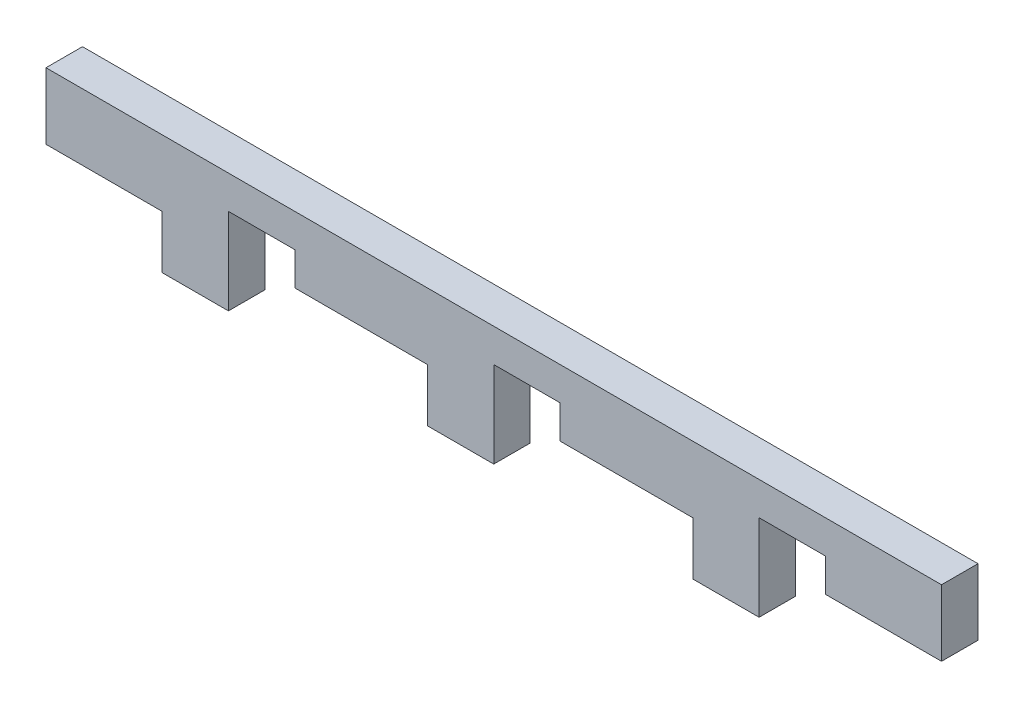
ISO-10303-21;
HEADER;
FILE_DESCRIPTION(('STEP AP214'),'2;1');
FILE_NAME('part.step','',(''),(''),'','','');
FILE_SCHEMA(('AUTOMOTIVE_DESIGN { 1 0 10303 214 1 1 1 1 }'));
ENDSEC;
DATA;
#1=APPLICATION_CONTEXT('core data for automotive mechanical design processes');
#2=APPLICATION_PROTOCOL_DEFINITION('international standard','automotive_design',2000,#1);
#3=PRODUCT_CONTEXT('',#1,'mechanical');
#4=PRODUCT('Part','Part','',(#3));
#5=PRODUCT_RELATED_PRODUCT_CATEGORY('part','',(#4));
#6=PRODUCT_DEFINITION_FORMATION('','',#4);
#7=PRODUCT_DEFINITION_CONTEXT('part definition',#1,'design');
#8=PRODUCT_DEFINITION('design','',#6,#7);
#9=PRODUCT_DEFINITION_SHAPE('','',#8);
#10=(LENGTH_UNIT() NAMED_UNIT(*) SI_UNIT(.MILLI.,.METRE.));
#11=(NAMED_UNIT(*) PLANE_ANGLE_UNIT() SI_UNIT($,.RADIAN.));
#12=(NAMED_UNIT(*) SI_UNIT($,.STERADIAN.) SOLID_ANGLE_UNIT());
#13=UNCERTAINTY_MEASURE_WITH_UNIT(LENGTH_MEASURE(1.E-05),#10,'distance_accuracy_value','');
#14=(GEOMETRIC_REPRESENTATION_CONTEXT(3) GLOBAL_UNCERTAINTY_ASSIGNED_CONTEXT((#13)) GLOBAL_UNIT_ASSIGNED_CONTEXT((#10,
#11,#12)) REPRESENTATION_CONTEXT('',''));
#15=CARTESIAN_POINT('',(0.,0.,0.));
#16=DIRECTION('',(0.,0.,1.));
#17=DIRECTION('',(1.,0.,0.));
#18=AXIS2_PLACEMENT_3D('',#15,#16,#17);
#19=CARTESIAN_POINT('',(67.5,-10.,5.5));
#20=DIRECTION('',(-1.,0.,0.));
#21=DIRECTION('',(0.,0.,1.));
#22=AXIS2_PLACEMENT_3D('',#19,#20,#21);
#23=PLANE('',#22);
#24=DIRECTION('',(0.,1.,0.));
#25=VECTOR('',#24,1.);
#26=CARTESIAN_POINT('',(67.5,-10.,0.));
#27=LINE('',#26,#25);
#28=CARTESIAN_POINT('',(67.5,-10.,0.));
#29=VERTEX_POINT('',#28);
#30=CARTESIAN_POINT('',(67.5,0.,0.));
#31=VERTEX_POINT('',#30);
#32=EDGE_CURVE('E230',#29,#31,#27,.T.);
#33=ORIENTED_EDGE('',*,*,#32,.T.);
#34=DIRECTION('',(0.,0.,-1.));
#35=VECTOR('',#34,1.);
#36=CARTESIAN_POINT('',(67.5,0.,5.5));
#37=LINE('',#36,#35);
#38=CARTESIAN_POINT('',(67.5,0.,5.5));
#39=VERTEX_POINT('',#38);
#40=EDGE_CURVE('E11',#39,#31,#37,.T.);
#41=ORIENTED_EDGE('',*,*,#40,.F.);
#42=DIRECTION('',(0.,1.,0.));
#43=VECTOR('',#42,1.);
#44=CARTESIAN_POINT('',(67.5,-10.,5.5));
#45=LINE('',#44,#43);
#46=CARTESIAN_POINT('',(67.5,-10.,5.5));
#47=VERTEX_POINT('',#46);
#48=EDGE_CURVE('E294',#47,#39,#45,.T.);
#49=ORIENTED_EDGE('',*,*,#48,.F.);
#50=DIRECTION('',(0.,0.,-1.));
#51=VECTOR('',#50,1.);
#52=CARTESIAN_POINT('',(67.5,-10.,5.5));
#53=LINE('',#52,#51);
#54=EDGE_CURVE('E226',#47,#29,#53,.T.);
#55=ORIENTED_EDGE('',*,*,#54,.T.);
#56=EDGE_LOOP('',(#33,#41,#49,#55));
#57=FACE_BOUND('',#56,.T.);
#58=ADVANCED_FACE('F45',(#57),#23,.F.);
#59=CARTESIAN_POINT('',(-67.5,0.,5.5));
#60=DIRECTION('',(0.,-1.,0.));
#61=DIRECTION('',(0.,0.,-1.));
#62=AXIS2_PLACEMENT_3D('',#59,#60,#61);
#63=PLANE('',#62);
#64=DIRECTION('',(-1.,0.,0.));
#65=VECTOR('',#64,1.);
#66=CARTESIAN_POINT('',(-67.5,0.,0.));
#67=LINE('',#66,#65);
#68=CARTESIAN_POINT('',(-67.5,0.,0.));
#69=VERTEX_POINT('',#68);
#70=EDGE_CURVE('E234',#31,#69,#67,.T.);
#71=ORIENTED_EDGE('',*,*,#70,.T.);
#72=DIRECTION('',(0.,0.,-1.));
#73=VECTOR('',#72,1.);
#74=CARTESIAN_POINT('',(-67.5,0.,5.5));
#75=LINE('',#74,#73);
#76=CARTESIAN_POINT('',(-67.5,0.,5.5));
#77=VERTEX_POINT('',#76);
#78=EDGE_CURVE('E54',#77,#69,#75,.T.);
#79=ORIENTED_EDGE('',*,*,#78,.F.);
#80=DIRECTION('',(-1.,0.,0.));
#81=VECTOR('',#80,1.);
#82=CARTESIAN_POINT('',(-67.5,0.,5.5));
#83=LINE('',#82,#81);
#84=EDGE_CURVE('E147',#39,#77,#83,.T.);
#85=ORIENTED_EDGE('',*,*,#84,.F.);
#86=ORIENTED_EDGE('',*,*,#40,.T.);
#87=EDGE_LOOP('',(#71,#79,#85,#86));
#88=FACE_BOUND('',#87,.T.);
#89=ADVANCED_FACE('F458',(#88),#63,.F.);
#90=CARTESIAN_POINT('',(-67.5,-10.,5.5));
#91=DIRECTION('',(1.,0.,0.));
#92=DIRECTION('',(0.,0.,-1.));
#93=AXIS2_PLACEMENT_3D('',#90,#91,#92);
#94=PLANE('',#93);
#95=DIRECTION('',(0.,-1.,0.));
#96=VECTOR('',#95,1.);
#97=CARTESIAN_POINT('',(-67.5,-10.,0.));
#98=LINE('',#97,#96);
#99=CARTESIAN_POINT('',(-67.5,-10.,0.));
#100=VERTEX_POINT('',#99);
#101=EDGE_CURVE('E237',#69,#100,#98,.T.);
#102=ORIENTED_EDGE('',*,*,#101,.T.);
#103=DIRECTION('',(0.,0.,-1.));
#104=VECTOR('',#103,1.);
#105=CARTESIAN_POINT('',(-67.5,-10.,5.5));
#106=LINE('',#105,#104);
#107=CARTESIAN_POINT('',(-67.5,-10.,5.5));
#108=VERTEX_POINT('',#107);
#109=EDGE_CURVE('E361',#108,#100,#106,.T.);
#110=ORIENTED_EDGE('',*,*,#109,.F.);
#111=DIRECTION('',(0.,-1.,0.));
#112=VECTOR('',#111,1.);
#113=CARTESIAN_POINT('',(-67.5,-10.,5.5));
#114=LINE('',#113,#112);
#115=EDGE_CURVE('E371',#77,#108,#114,.T.);
#116=ORIENTED_EDGE('',*,*,#115,.F.);
#117=ORIENTED_EDGE('',*,*,#78,.T.);
#118=EDGE_LOOP('',(#102,#110,#116,#117));
#119=FACE_BOUND('',#118,.T.);
#120=ADVANCED_FACE('F369',(#119),#94,.F.);
#121=CARTESIAN_POINT('',(-50.,-10.,5.5));
#122=DIRECTION('',(0.,1.,0.));
#123=DIRECTION('',(-1.,0.,0.));
#124=AXIS2_PLACEMENT_3D('',#121,#122,#123);
#125=PLANE('',#124);
#126=DIRECTION('',(1.,0.,0.));
#127=VECTOR('',#126,1.);
#128=CARTESIAN_POINT('',(-50.,-10.,0.));
#129=LINE('',#128,#127);
#130=CARTESIAN_POINT('',(-50.,-10.,0.));
#131=VERTEX_POINT('',#130);
#132=EDGE_CURVE('E240',#100,#131,#129,.T.);
#133=ORIENTED_EDGE('',*,*,#132,.T.);
#134=DIRECTION('',(0.,0.,-1.));
#135=VECTOR('',#134,1.);
#136=CARTESIAN_POINT('',(-50.,-10.,5.5));
#137=LINE('',#136,#135);
#138=CARTESIAN_POINT('',(-50.,-10.,5.5));
#139=VERTEX_POINT('',#138);
#140=EDGE_CURVE('E357',#139,#131,#137,.T.);
#141=ORIENTED_EDGE('',*,*,#140,.F.);
#142=DIRECTION('',(1.,0.,0.));
#143=VECTOR('',#142,1.);
#144=CARTESIAN_POINT('',(-50.,-10.,5.5));
#145=LINE('',#144,#143);
#146=EDGE_CURVE('E390',#108,#139,#145,.T.);
#147=ORIENTED_EDGE('',*,*,#146,.F.);
#148=ORIENTED_EDGE('',*,*,#109,.T.);
#149=EDGE_LOOP('',(#133,#141,#147,#148));
#150=FACE_BOUND('',#149,.T.);
#151=ADVANCED_FACE('F380',(#150),#125,.F.);
#152=CARTESIAN_POINT('',(-50.,-10.,5.5));
#153=DIRECTION('',(1.,0.,0.));
#154=DIRECTION('',(0.,0.,-1.));
#155=AXIS2_PLACEMENT_3D('',#152,#153,#154);
#156=PLANE('',#155);
#157=DIRECTION('',(0.,-1.,0.));
#158=VECTOR('',#157,1.);
#159=CARTESIAN_POINT('',(-50.,-10.,0.));
#160=LINE('',#159,#158);
#161=CARTESIAN_POINT('',(-50.,-18.,0.));
#162=VERTEX_POINT('',#161);
#163=EDGE_CURVE('E243',#131,#162,#160,.T.);
#164=ORIENTED_EDGE('',*,*,#163,.T.);
#165=DIRECTION('',(0.,0.,-1.));
#166=VECTOR('',#165,1.);
#167=CARTESIAN_POINT('',(-50.,-18.,5.5));
#168=LINE('',#167,#166);
#169=CARTESIAN_POINT('',(-50.,-18.,5.5));
#170=VERTEX_POINT('',#169);
#171=EDGE_CURVE('E353',#170,#162,#168,.T.);
#172=ORIENTED_EDGE('',*,*,#171,.F.);
#173=DIRECTION('',(0.,-1.,0.));
#174=VECTOR('',#173,1.);
#175=CARTESIAN_POINT('',(-50.,-10.,5.5));
#176=LINE('',#175,#174);
#177=EDGE_CURVE('E386',#139,#170,#176,.T.);
#178=ORIENTED_EDGE('',*,*,#177,.F.);
#179=ORIENTED_EDGE('',*,*,#140,.T.);
#180=EDGE_LOOP('',(#164,#172,#178,#179));
#181=FACE_BOUND('',#180,.T.);
#182=ADVANCED_FACE('F384',(#181),#156,.F.);
#183=CARTESIAN_POINT('',(-50.,-18.,5.5));
#184=DIRECTION('',(0.,1.,0.));
#185=DIRECTION('',(0.,0.,1.));
#186=AXIS2_PLACEMENT_3D('',#183,#184,#185);
#187=PLANE('',#186);
#188=DIRECTION('',(1.,0.,0.));
#189=VECTOR('',#188,1.);
#190=CARTESIAN_POINT('',(-50.,-18.,0.));
#191=LINE('',#190,#189);
#192=CARTESIAN_POINT('',(-40.,-18.,0.));
#193=VERTEX_POINT('',#192);
#194=EDGE_CURVE('E246',#162,#193,#191,.T.);
#195=ORIENTED_EDGE('',*,*,#194,.T.);
#196=DIRECTION('',(0.,0.,-1.));
#197=VECTOR('',#196,1.);
#198=CARTESIAN_POINT('',(-40.,-18.,5.5));
#199=LINE('',#198,#197);
#200=CARTESIAN_POINT('',(-40.,-18.,5.5));
#201=VERTEX_POINT('',#200);
#202=EDGE_CURVE('E349',#201,#193,#199,.T.);
#203=ORIENTED_EDGE('',*,*,#202,.F.);
#204=DIRECTION('',(1.,0.,0.));
#205=VECTOR('',#204,1.);
#206=CARTESIAN_POINT('',(-50.,-18.,5.5));
#207=LINE('',#206,#205);
#208=EDGE_CURVE('E389',#170,#201,#207,.T.);
#209=ORIENTED_EDGE('',*,*,#208,.F.);
#210=ORIENTED_EDGE('',*,*,#171,.T.);
#211=EDGE_LOOP('',(#195,#203,#209,#210));
#212=FACE_BOUND('',#211,.T.);
#213=ADVANCED_FACE('F471',(#212),#187,.F.);
#214=CARTESIAN_POINT('',(-40.,-18.,5.5));
#215=DIRECTION('',(-1.,0.,0.));
#216=DIRECTION('',(0.,0.,1.));
#217=AXIS2_PLACEMENT_3D('',#214,#215,#216);
#218=PLANE('',#217);
#219=DIRECTION('',(0.,1.,0.));
#220=VECTOR('',#219,1.);
#221=CARTESIAN_POINT('',(-40.,-18.,0.));
#222=LINE('',#221,#220);
#223=CARTESIAN_POINT('',(-40.,-5.00000000000001,0.));
#224=VERTEX_POINT('',#223);
#225=EDGE_CURVE('E249',#193,#224,#222,.T.);
#226=ORIENTED_EDGE('',*,*,#225,.T.);
#227=DIRECTION('',(0.,0.,-1.));
#228=VECTOR('',#227,1.);
#229=CARTESIAN_POINT('',(-40.,-5.00000000000001,5.5));
#230=LINE('',#229,#228);
#231=CARTESIAN_POINT('',(-40.,-5.00000000000001,5.5));
#232=VERTEX_POINT('',#231);
#233=EDGE_CURVE('E345',#232,#224,#230,.T.);
#234=ORIENTED_EDGE('',*,*,#233,.F.);
#235=DIRECTION('',(0.,1.,0.));
#236=VECTOR('',#235,1.);
#237=CARTESIAN_POINT('',(-40.,-18.,5.5));
#238=LINE('',#237,#236);
#239=EDGE_CURVE('E394',#201,#232,#238,.T.);
#240=ORIENTED_EDGE('',*,*,#239,.F.);
#241=ORIENTED_EDGE('',*,*,#202,.T.);
#242=EDGE_LOOP('',(#226,#234,#240,#241));
#243=FACE_BOUND('',#242,.T.);
#244=ADVANCED_FACE('F474',(#243),#218,.F.);
#245=CARTESIAN_POINT('',(-40.,-5.00000000000001,5.5));
#246=DIRECTION('',(0.,1.,0.));
#247=DIRECTION('',(0.,0.,1.));
#248=AXIS2_PLACEMENT_3D('',#245,#246,#247);
#249=PLANE('',#248);
#250=DIRECTION('',(1.,0.,0.));
#251=VECTOR('',#250,1.);
#252=CARTESIAN_POINT('',(-40.,-5.00000000000001,0.));
#253=LINE('',#252,#251);
#254=CARTESIAN_POINT('',(-30.,-5.00000000000001,0.));
#255=VERTEX_POINT('',#254);
#256=EDGE_CURVE('E252',#224,#255,#253,.T.);
#257=ORIENTED_EDGE('',*,*,#256,.T.);
#258=DIRECTION('',(0.,0.,-1.));
#259=VECTOR('',#258,1.);
#260=CARTESIAN_POINT('',(-30.,-5.00000000000001,5.5));
#261=LINE('',#260,#259);
#262=CARTESIAN_POINT('',(-30.,-5.00000000000001,5.5));
#263=VERTEX_POINT('',#262);
#264=EDGE_CURVE('E341',#263,#255,#261,.T.);
#265=ORIENTED_EDGE('',*,*,#264,.F.);
#266=DIRECTION('',(1.,0.,0.));
#267=VECTOR('',#266,1.);
#268=CARTESIAN_POINT('',(-40.,-5.00000000000001,5.5));
#269=LINE('',#268,#267);
#270=EDGE_CURVE('E401',#232,#263,#269,.T.);
#271=ORIENTED_EDGE('',*,*,#270,.F.);
#272=ORIENTED_EDGE('',*,*,#233,.T.);
#273=EDGE_LOOP('',(#257,#265,#271,#272));
#274=FACE_BOUND('',#273,.T.);
#275=ADVANCED_FACE('F478',(#274),#249,.F.);
#276=CARTESIAN_POINT('',(-30.,-5.00000000000001,5.5));
#277=DIRECTION('',(1.,0.,0.));
#278=DIRECTION('',(0.,0.,-1.));
#279=AXIS2_PLACEMENT_3D('',#276,#277,#278);
#280=PLANE('',#279);
#281=DIRECTION('',(0.,-1.,0.));
#282=VECTOR('',#281,1.);
#283=CARTESIAN_POINT('',(-30.,-5.00000000000001,0.));
#284=LINE('',#283,#282);
#285=CARTESIAN_POINT('',(-30.,-10.,0.));
#286=VERTEX_POINT('',#285);
#287=EDGE_CURVE('E255',#255,#286,#284,.T.);
#288=ORIENTED_EDGE('',*,*,#287,.T.);
#289=DIRECTION('',(0.,0.,-1.));
#290=VECTOR('',#289,1.);
#291=CARTESIAN_POINT('',(-30.,-10.,5.5));
#292=LINE('',#291,#290);
#293=CARTESIAN_POINT('',(-30.,-10.,5.5));
#294=VERTEX_POINT('',#293);
#295=EDGE_CURVE('E337',#294,#286,#292,.T.);
#296=ORIENTED_EDGE('',*,*,#295,.F.);
#297=DIRECTION('',(0.,-1.,0.));
#298=VECTOR('',#297,1.);
#299=CARTESIAN_POINT('',(-30.,-5.00000000000001,5.5));
#300=LINE('',#299,#298);
#301=EDGE_CURVE('E404',#263,#294,#300,.T.);
#302=ORIENTED_EDGE('',*,*,#301,.F.);
#303=ORIENTED_EDGE('',*,*,#264,.T.);
#304=EDGE_LOOP('',(#288,#296,#302,#303));
#305=FACE_BOUND('',#304,.T.);
#306=ADVANCED_FACE('F482',(#305),#280,.F.);
#307=CARTESIAN_POINT('',(-10.,-10.,5.5));
#308=DIRECTION('',(0.,1.,0.));
#309=DIRECTION('',(0.,0.,1.));
#310=AXIS2_PLACEMENT_3D('',#307,#308,#309);
#311=PLANE('',#310);
#312=DIRECTION('',(1.,0.,0.));
#313=VECTOR('',#312,1.);
#314=CARTESIAN_POINT('',(-10.,-10.,0.));
#315=LINE('',#314,#313);
#316=CARTESIAN_POINT('',(-10.,-10.,0.));
#317=VERTEX_POINT('',#316);
#318=EDGE_CURVE('E258',#286,#317,#315,.T.);
#319=ORIENTED_EDGE('',*,*,#318,.T.);
#320=DIRECTION('',(0.,0.,-1.));
#321=VECTOR('',#320,1.);
#322=CARTESIAN_POINT('',(-10.,-10.,5.5));
#323=LINE('',#322,#321);
#324=CARTESIAN_POINT('',(-10.,-10.,5.5));
#325=VERTEX_POINT('',#324);
#326=EDGE_CURVE('E333',#325,#317,#323,.T.);
#327=ORIENTED_EDGE('',*,*,#326,.F.);
#328=DIRECTION('',(1.,0.,0.));
#329=VECTOR('',#328,1.);
#330=CARTESIAN_POINT('',(-10.,-10.,5.5));
#331=LINE('',#330,#329);
#332=EDGE_CURVE('E407',#294,#325,#331,.T.);
#333=ORIENTED_EDGE('',*,*,#332,.F.);
#334=ORIENTED_EDGE('',*,*,#295,.T.);
#335=EDGE_LOOP('',(#319,#327,#333,#334));
#336=FACE_BOUND('',#335,.T.);
#337=ADVANCED_FACE('F486',(#336),#311,.F.);
#338=CARTESIAN_POINT('',(-10.,-10.,5.5));
#339=DIRECTION('',(1.,0.,0.));
#340=DIRECTION('',(0.,0.,-1.));
#341=AXIS2_PLACEMENT_3D('',#338,#339,#340);
#342=PLANE('',#341);
#343=DIRECTION('',(0.,-1.,0.));
#344=VECTOR('',#343,1.);
#345=CARTESIAN_POINT('',(-10.,-10.,0.));
#346=LINE('',#345,#344);
#347=CARTESIAN_POINT('',(-10.,-18.,0.));
#348=VERTEX_POINT('',#347);
#349=EDGE_CURVE('E261',#317,#348,#346,.T.);
#350=ORIENTED_EDGE('',*,*,#349,.T.);
#351=DIRECTION('',(0.,0.,-1.));
#352=VECTOR('',#351,1.);
#353=CARTESIAN_POINT('',(-10.,-18.,5.5));
#354=LINE('',#353,#352);
#355=CARTESIAN_POINT('',(-10.,-18.,5.5));
#356=VERTEX_POINT('',#355);
#357=EDGE_CURVE('E329',#356,#348,#354,.T.);
#358=ORIENTED_EDGE('',*,*,#357,.F.);
#359=DIRECTION('',(0.,-1.,0.));
#360=VECTOR('',#359,1.);
#361=CARTESIAN_POINT('',(-10.,-10.,5.5));
#362=LINE('',#361,#360);
#363=EDGE_CURVE('E410',#325,#356,#362,.T.);
#364=ORIENTED_EDGE('',*,*,#363,.F.);
#365=ORIENTED_EDGE('',*,*,#326,.T.);
#366=EDGE_LOOP('',(#350,#358,#364,#365));
#367=FACE_BOUND('',#366,.T.);
#368=ADVANCED_FACE('F490',(#367),#342,.F.);
#369=CARTESIAN_POINT('',(-10.,-18.,5.5));
#370=DIRECTION('',(0.,1.,0.));
#371=DIRECTION('',(0.,0.,1.));
#372=AXIS2_PLACEMENT_3D('',#369,#370,#371);
#373=PLANE('',#372);
#374=DIRECTION('',(1.,0.,0.));
#375=VECTOR('',#374,1.);
#376=CARTESIAN_POINT('',(-10.,-18.,0.));
#377=LINE('',#376,#375);
#378=CARTESIAN_POINT('',(0.,-18.,0.));
#379=VERTEX_POINT('',#378);
#380=EDGE_CURVE('E264',#348,#379,#377,.T.);
#381=ORIENTED_EDGE('',*,*,#380,.T.);
#382=DIRECTION('',(0.,0.,-1.));
#383=VECTOR('',#382,1.);
#384=CARTESIAN_POINT('',(0.,-18.,5.5));
#385=LINE('',#384,#383);
#386=CARTESIAN_POINT('',(0.,-18.,5.5));
#387=VERTEX_POINT('',#386);
#388=EDGE_CURVE('E325',#387,#379,#385,.T.);
#389=ORIENTED_EDGE('',*,*,#388,.F.);
#390=DIRECTION('',(1.,0.,0.));
#391=VECTOR('',#390,1.);
#392=CARTESIAN_POINT('',(-10.,-18.,5.5));
#393=LINE('',#392,#391);
#394=EDGE_CURVE('E413',#356,#387,#393,.T.);
#395=ORIENTED_EDGE('',*,*,#394,.F.);
#396=ORIENTED_EDGE('',*,*,#357,.T.);
#397=EDGE_LOOP('',(#381,#389,#395,#396));
#398=FACE_BOUND('',#397,.T.);
#399=ADVANCED_FACE('F494',(#398),#373,.F.);
#400=CARTESIAN_POINT('',(0.,-18.,5.5));
#401=DIRECTION('',(-1.,0.,0.));
#402=DIRECTION('',(0.,-1.,0.));
#403=AXIS2_PLACEMENT_3D('',#400,#401,#402);
#404=PLANE('',#403);
#405=DIRECTION('',(0.,1.,0.));
#406=VECTOR('',#405,1.);
#407=CARTESIAN_POINT('',(0.,-18.,0.));
#408=LINE('',#407,#406);
#409=CARTESIAN_POINT('',(0.,-5.00000000000001,0.));
#410=VERTEX_POINT('',#409);
#411=EDGE_CURVE('E267',#379,#410,#408,.T.);
#412=ORIENTED_EDGE('',*,*,#411,.T.);
#413=DIRECTION('',(0.,0.,-1.));
#414=VECTOR('',#413,1.);
#415=CARTESIAN_POINT('',(0.,-5.00000000000001,5.5));
#416=LINE('',#415,#414);
#417=CARTESIAN_POINT('',(0.,-5.00000000000001,5.5));
#418=VERTEX_POINT('',#417);
#419=EDGE_CURVE('E321',#418,#410,#416,.T.);
#420=ORIENTED_EDGE('',*,*,#419,.F.);
#421=DIRECTION('',(0.,1.,0.));
#422=VECTOR('',#421,1.);
#423=CARTESIAN_POINT('',(0.,-18.,5.5));
#424=LINE('',#423,#422);
#425=EDGE_CURVE('E416',#387,#418,#424,.T.);
#426=ORIENTED_EDGE('',*,*,#425,.F.);
#427=ORIENTED_EDGE('',*,*,#388,.T.);
#428=EDGE_LOOP('',(#412,#420,#426,#427));
#429=FACE_BOUND('',#428,.T.);
#430=ADVANCED_FACE('F498',(#429),#404,.F.);
#431=CARTESIAN_POINT('',(0.,-5.00000000000001,5.5));
#432=DIRECTION('',(0.,1.,0.));
#433=DIRECTION('',(0.,0.,1.));
#434=AXIS2_PLACEMENT_3D('',#431,#432,#433);
#435=PLANE('',#434);
#436=DIRECTION('',(1.,0.,0.));
#437=VECTOR('',#436,1.);
#438=CARTESIAN_POINT('',(0.,-5.00000000000001,0.));
#439=LINE('',#438,#437);
#440=CARTESIAN_POINT('',(10.,-5.00000000000001,0.));
#441=VERTEX_POINT('',#440);
#442=EDGE_CURVE('E270',#410,#441,#439,.T.);
#443=ORIENTED_EDGE('',*,*,#442,.T.);
#444=DIRECTION('',(0.,0.,-1.));
#445=VECTOR('',#444,1.);
#446=CARTESIAN_POINT('',(10.,-5.00000000000001,5.5));
#447=LINE('',#446,#445);
#448=CARTESIAN_POINT('',(10.,-5.00000000000001,5.5));
#449=VERTEX_POINT('',#448);
#450=EDGE_CURVE('E317',#449,#441,#447,.T.);
#451=ORIENTED_EDGE('',*,*,#450,.F.);
#452=DIRECTION('',(1.,0.,0.));
#453=VECTOR('',#452,1.);
#454=CARTESIAN_POINT('',(0.,-5.00000000000001,5.5));
#455=LINE('',#454,#453);
#456=EDGE_CURVE('E419',#418,#449,#455,.T.);
#457=ORIENTED_EDGE('',*,*,#456,.F.);
#458=ORIENTED_EDGE('',*,*,#419,.T.);
#459=EDGE_LOOP('',(#443,#451,#457,#458));
#460=FACE_BOUND('',#459,.T.);
#461=ADVANCED_FACE('F502',(#460),#435,.F.);
#462=CARTESIAN_POINT('',(10.,-5.00000000000001,5.5));
#463=DIRECTION('',(1.,0.,0.));
#464=DIRECTION('',(0.,0.,-1.));
#465=AXIS2_PLACEMENT_3D('',#462,#463,#464);
#466=PLANE('',#465);
#467=DIRECTION('',(0.,-1.,0.));
#468=VECTOR('',#467,1.);
#469=CARTESIAN_POINT('',(10.,-5.00000000000001,0.));
#470=LINE('',#469,#468);
#471=CARTESIAN_POINT('',(10.,-10.,0.));
#472=VERTEX_POINT('',#471);
#473=EDGE_CURVE('E273',#441,#472,#470,.T.);
#474=ORIENTED_EDGE('',*,*,#473,.T.);
#475=DIRECTION('',(0.,0.,-1.));
#476=VECTOR('',#475,1.);
#477=CARTESIAN_POINT('',(10.,-10.,5.5));
#478=LINE('',#477,#476);
#479=CARTESIAN_POINT('',(10.,-10.,5.5));
#480=VERTEX_POINT('',#479);
#481=EDGE_CURVE('E313',#480,#472,#478,.T.);
#482=ORIENTED_EDGE('',*,*,#481,.F.);
#483=DIRECTION('',(0.,-1.,0.));
#484=VECTOR('',#483,1.);
#485=CARTESIAN_POINT('',(10.,-5.00000000000001,5.5));
#486=LINE('',#485,#484);
#487=EDGE_CURVE('E422',#449,#480,#486,.T.);
#488=ORIENTED_EDGE('',*,*,#487,.F.);
#489=ORIENTED_EDGE('',*,*,#450,.T.);
#490=EDGE_LOOP('',(#474,#482,#488,#489));
#491=FACE_BOUND('',#490,.T.);
#492=ADVANCED_FACE('F506',(#491),#466,.F.);
#493=CARTESIAN_POINT('',(10.,-10.,5.5));
#494=DIRECTION('',(0.,1.,0.));
#495=DIRECTION('',(-1.,0.,0.));
#496=AXIS2_PLACEMENT_3D('',#493,#494,#495);
#497=PLANE('',#496);
#498=DIRECTION('',(1.,0.,0.));
#499=VECTOR('',#498,1.);
#500=CARTESIAN_POINT('',(10.,-10.,0.));
#501=LINE('',#500,#499);
#502=CARTESIAN_POINT('',(30.,-9.99999999999999,0.));
#503=VERTEX_POINT('',#502);
#504=EDGE_CURVE('E276',#472,#503,#501,.T.);
#505=ORIENTED_EDGE('',*,*,#504,.T.);
#506=DIRECTION('',(0.,0.,-1.));
#507=VECTOR('',#506,1.);
#508=CARTESIAN_POINT('',(30.,-9.99999999999999,5.5));
#509=LINE('',#508,#507);
#510=CARTESIAN_POINT('',(30.,-9.99999999999999,5.5));
#511=VERTEX_POINT('',#510);
#512=EDGE_CURVE('E309',#511,#503,#509,.T.);
#513=ORIENTED_EDGE('',*,*,#512,.F.);
#514=DIRECTION('',(1.,0.,0.));
#515=VECTOR('',#514,1.);
#516=CARTESIAN_POINT('',(10.,-10.,5.5));
#517=LINE('',#516,#515);
#518=EDGE_CURVE('E425',#480,#511,#517,.T.);
#519=ORIENTED_EDGE('',*,*,#518,.F.);
#520=ORIENTED_EDGE('',*,*,#481,.T.);
#521=EDGE_LOOP('',(#505,#513,#519,#520));
#522=FACE_BOUND('',#521,.T.);
#523=ADVANCED_FACE('F510',(#522),#497,.F.);
#524=CARTESIAN_POINT('',(30.,-9.99999999999999,5.5));
#525=DIRECTION('',(1.,0.,0.));
#526=DIRECTION('',(0.,0.,-1.));
#527=AXIS2_PLACEMENT_3D('',#524,#525,#526);
#528=PLANE('',#527);
#529=DIRECTION('',(0.,-1.,0.));
#530=VECTOR('',#529,1.);
#531=CARTESIAN_POINT('',(30.,-9.99999999999999,0.));
#532=LINE('',#531,#530);
#533=CARTESIAN_POINT('',(30.,-18.,0.));
#534=VERTEX_POINT('',#533);
#535=EDGE_CURVE('E279',#503,#534,#532,.T.);
#536=ORIENTED_EDGE('',*,*,#535,.T.);
#537=DIRECTION('',(0.,0.,-1.));
#538=VECTOR('',#537,1.);
#539=CARTESIAN_POINT('',(30.,-18.,5.5));
#540=LINE('',#539,#538);
#541=CARTESIAN_POINT('',(30.,-18.,5.5));
#542=VERTEX_POINT('',#541);
#543=EDGE_CURVE('E305',#542,#534,#540,.T.);
#544=ORIENTED_EDGE('',*,*,#543,.F.);
#545=DIRECTION('',(0.,-1.,0.));
#546=VECTOR('',#545,1.);
#547=CARTESIAN_POINT('',(30.,-9.99999999999999,5.5));
#548=LINE('',#547,#546);
#549=EDGE_CURVE('E428',#511,#542,#548,.T.);
#550=ORIENTED_EDGE('',*,*,#549,.F.);
#551=ORIENTED_EDGE('',*,*,#512,.T.);
#552=EDGE_LOOP('',(#536,#544,#550,#551));
#553=FACE_BOUND('',#552,.T.);
#554=ADVANCED_FACE('F514',(#553),#528,.F.);
#555=CARTESIAN_POINT('',(30.,-18.,5.5));
#556=DIRECTION('',(0.,1.,0.));
#557=DIRECTION('',(0.,0.,1.));
#558=AXIS2_PLACEMENT_3D('',#555,#556,#557);
#559=PLANE('',#558);
#560=DIRECTION('',(1.,0.,0.));
#561=VECTOR('',#560,1.);
#562=CARTESIAN_POINT('',(30.,-18.,0.));
#563=LINE('',#562,#561);
#564=CARTESIAN_POINT('',(40.,-18.,0.));
#565=VERTEX_POINT('',#564);
#566=EDGE_CURVE('E282',#534,#565,#563,.T.);
#567=ORIENTED_EDGE('',*,*,#566,.T.);
#568=DIRECTION('',(0.,0.,-1.));
#569=VECTOR('',#568,1.);
#570=CARTESIAN_POINT('',(40.,-18.,5.5));
#571=LINE('',#570,#569);
#572=CARTESIAN_POINT('',(40.,-18.,5.5));
#573=VERTEX_POINT('',#572);
#574=EDGE_CURVE('E301',#573,#565,#571,.T.);
#575=ORIENTED_EDGE('',*,*,#574,.F.);
#576=DIRECTION('',(1.,0.,0.));
#577=VECTOR('',#576,1.);
#578=CARTESIAN_POINT('',(30.,-18.,5.5));
#579=LINE('',#578,#577);
#580=EDGE_CURVE('E431',#542,#573,#579,.T.);
#581=ORIENTED_EDGE('',*,*,#580,.F.);
#582=ORIENTED_EDGE('',*,*,#543,.T.);
#583=EDGE_LOOP('',(#567,#575,#581,#582));
#584=FACE_BOUND('',#583,.T.);
#585=ADVANCED_FACE('F439',(#584),#559,.F.);
#586=CARTESIAN_POINT('',(40.,-18.,5.5));
#587=DIRECTION('',(-1.,0.,0.));
#588=DIRECTION('',(0.,0.,1.));
#589=AXIS2_PLACEMENT_3D('',#586,#587,#588);
#590=PLANE('',#589);
#591=DIRECTION('',(0.,1.,0.));
#592=VECTOR('',#591,1.);
#593=CARTESIAN_POINT('',(40.,-18.,0.));
#594=LINE('',#593,#592);
#595=CARTESIAN_POINT('',(40.,-5.00000000000001,0.));
#596=VERTEX_POINT('',#595);
#597=EDGE_CURVE('E285',#565,#596,#594,.T.);
#598=ORIENTED_EDGE('',*,*,#597,.T.);
#599=DIRECTION('',(0.,0.,-1.));
#600=VECTOR('',#599,1.);
#601=CARTESIAN_POINT('',(40.,-5.00000000000001,5.5));
#602=LINE('',#601,#600);
#603=CARTESIAN_POINT('',(40.,-5.00000000000001,5.5));
#604=VERTEX_POINT('',#603);
#605=EDGE_CURVE('E219',#604,#596,#602,.T.);
#606=ORIENTED_EDGE('',*,*,#605,.F.);
#607=DIRECTION('',(0.,1.,0.));
#608=VECTOR('',#607,1.);
#609=CARTESIAN_POINT('',(40.,-18.,5.5));
#610=LINE('',#609,#608);
#611=EDGE_CURVE('E208',#573,#604,#610,.T.);
#612=ORIENTED_EDGE('',*,*,#611,.F.);
#613=ORIENTED_EDGE('',*,*,#574,.T.);
#614=EDGE_LOOP('',(#598,#606,#612,#613));
#615=FACE_BOUND('',#614,.T.);
#616=ADVANCED_FACE('F443',(#615),#590,.F.);
#617=CARTESIAN_POINT('',(40.,-5.00000000000001,5.5));
#618=DIRECTION('',(0.,1.,0.));
#619=DIRECTION('',(0.,0.,1.));
#620=AXIS2_PLACEMENT_3D('',#617,#618,#619);
#621=PLANE('',#620);
#622=DIRECTION('',(1.,0.,0.));
#623=VECTOR('',#622,1.);
#624=CARTESIAN_POINT('',(40.,-5.00000000000001,0.));
#625=LINE('',#624,#623);
#626=CARTESIAN_POINT('',(50.,-5.00000000000001,0.));
#627=VERTEX_POINT('',#626);
#628=EDGE_CURVE('E217',#596,#627,#625,.T.);
#629=ORIENTED_EDGE('',*,*,#628,.T.);
#630=DIRECTION('',(0.,0.,-1.));
#631=VECTOR('',#630,1.);
#632=CARTESIAN_POINT('',(50.,-5.00000000000001,5.5));
#633=LINE('',#632,#631);
#634=CARTESIAN_POINT('',(50.,-5.00000000000001,5.5));
#635=VERTEX_POINT('',#634);
#636=EDGE_CURVE('E214',#635,#627,#633,.T.);
#637=ORIENTED_EDGE('',*,*,#636,.F.);
#638=DIRECTION('',(1.,0.,0.));
#639=VECTOR('',#638,1.);
#640=CARTESIAN_POINT('',(40.,-5.00000000000001,5.5));
#641=LINE('',#640,#639);
#642=EDGE_CURVE('E202',#604,#635,#641,.T.);
#643=ORIENTED_EDGE('',*,*,#642,.F.);
#644=ORIENTED_EDGE('',*,*,#605,.T.);
#645=EDGE_LOOP('',(#629,#637,#643,#644));
#646=FACE_BOUND('',#645,.T.);
#647=ADVANCED_FACE('F215',(#646),#621,.F.);
#648=CARTESIAN_POINT('',(50.,-5.00000000000001,5.5));
#649=DIRECTION('',(1.,0.,0.));
#650=DIRECTION('',(0.,0.,-1.));
#651=AXIS2_PLACEMENT_3D('',#648,#649,#650);
#652=PLANE('',#651);
#653=DIRECTION('',(0.,-1.,0.));
#654=VECTOR('',#653,1.);
#655=CARTESIAN_POINT('',(50.,-5.00000000000001,0.));
#656=LINE('',#655,#654);
#657=CARTESIAN_POINT('',(50.,-9.99999999999999,0.));
#658=VERTEX_POINT('',#657);
#659=EDGE_CURVE('E133',#627,#658,#656,.T.);
#660=ORIENTED_EDGE('',*,*,#659,.T.);
#661=DIRECTION('',(0.,0.,-1.));
#662=VECTOR('',#661,1.);
#663=CARTESIAN_POINT('',(50.,-9.99999999999999,5.5));
#664=LINE('',#663,#662);
#665=CARTESIAN_POINT('',(50.,-9.99999999999999,5.5));
#666=VERTEX_POINT('',#665);
#667=EDGE_CURVE('E220',#666,#658,#664,.T.);
#668=ORIENTED_EDGE('',*,*,#667,.F.);
#669=DIRECTION('',(0.,-1.,0.));
#670=VECTOR('',#669,1.);
#671=CARTESIAN_POINT('',(50.,-5.00000000000001,5.5));
#672=LINE('',#671,#670);
#673=EDGE_CURVE('E206',#635,#666,#672,.T.);
#674=ORIENTED_EDGE('',*,*,#673,.F.);
#675=ORIENTED_EDGE('',*,*,#636,.T.);
#676=EDGE_LOOP('',(#660,#668,#674,#675));
#677=FACE_BOUND('',#676,.T.);
#678=ADVANCED_FACE('F222',(#677),#652,.F.);
#679=CARTESIAN_POINT('',(50.,-9.99999999999999,5.5));
#680=DIRECTION('',(0.,1.,0.));
#681=DIRECTION('',(-1.,0.,0.));
#682=AXIS2_PLACEMENT_3D('',#679,#680,#681);
#683=PLANE('',#682);
#684=DIRECTION('',(1.,0.,0.));
#685=VECTOR('',#684,1.);
#686=CARTESIAN_POINT('',(50.,-9.99999999999999,0.));
#687=LINE('',#686,#685);
#688=EDGE_CURVE('E139',#658,#29,#687,.T.);
#689=ORIENTED_EDGE('',*,*,#688,.T.);
#690=ORIENTED_EDGE('',*,*,#54,.F.);
#691=DIRECTION('',(1.,0.,0.));
#692=VECTOR('',#691,1.);
#693=CARTESIAN_POINT('',(50.,-9.99999999999999,5.5));
#694=LINE('',#693,#692);
#695=EDGE_CURVE('E62',#666,#47,#694,.T.);
#696=ORIENTED_EDGE('',*,*,#695,.F.);
#697=ORIENTED_EDGE('',*,*,#667,.T.);
#698=EDGE_LOOP('',(#689,#690,#696,#697));
#699=FACE_BOUND('',#698,.T.);
#700=ADVANCED_FACE('F447',(#699),#683,.F.);
#701=CARTESIAN_POINT('',(0.,0.,5.5));
#702=DIRECTION('',(0.,0.,-1.));
#703=DIRECTION('',(-1.,0.,0.));
#704=AXIS2_PLACEMENT_3D('',#701,#702,#703);
#705=PLANE('',#704);
#706=ORIENTED_EDGE('',*,*,#48,.T.);
#707=ORIENTED_EDGE('',*,*,#84,.T.);
#708=ORIENTED_EDGE('',*,*,#115,.T.);
#709=ORIENTED_EDGE('',*,*,#146,.T.);
#710=ORIENTED_EDGE('',*,*,#177,.T.);
#711=ORIENTED_EDGE('',*,*,#208,.T.);
#712=ORIENTED_EDGE('',*,*,#239,.T.);
#713=ORIENTED_EDGE('',*,*,#270,.T.);
#714=ORIENTED_EDGE('',*,*,#301,.T.);
#715=ORIENTED_EDGE('',*,*,#332,.T.);
#716=ORIENTED_EDGE('',*,*,#363,.T.);
#717=ORIENTED_EDGE('',*,*,#394,.T.);
#718=ORIENTED_EDGE('',*,*,#425,.T.);
#719=ORIENTED_EDGE('',*,*,#456,.T.);
#720=ORIENTED_EDGE('',*,*,#487,.T.);
#721=ORIENTED_EDGE('',*,*,#518,.T.);
#722=ORIENTED_EDGE('',*,*,#549,.T.);
#723=ORIENTED_EDGE('',*,*,#580,.T.);
#724=ORIENTED_EDGE('',*,*,#611,.T.);
#725=ORIENTED_EDGE('',*,*,#642,.T.);
#726=ORIENTED_EDGE('',*,*,#673,.T.);
#727=ORIENTED_EDGE('',*,*,#695,.T.);
#728=EDGE_LOOP('',(#706,#707,#708,#709,#710,#711,#712,#713,#714,#715,#716,#717,#718,#719,#720,
#721,#722,#723,#724,#725,#726,#727));
#729=FACE_BOUND('',#728,.T.);
#730=ADVANCED_FACE('F204',(#729),#705,.F.);
#731=CARTESIAN_POINT('',(0.,0.,0.));
#732=DIRECTION('',(0.,0.,-1.));
#733=DIRECTION('',(-1.,0.,0.));
#734=AXIS2_PLACEMENT_3D('',#731,#732,#733);
#735=PLANE('',#734);
#736=ORIENTED_EDGE('',*,*,#32,.F.);
#737=ORIENTED_EDGE('',*,*,#688,.F.);
#738=ORIENTED_EDGE('',*,*,#659,.F.);
#739=ORIENTED_EDGE('',*,*,#628,.F.);
#740=ORIENTED_EDGE('',*,*,#597,.F.);
#741=ORIENTED_EDGE('',*,*,#566,.F.);
#742=ORIENTED_EDGE('',*,*,#535,.F.);
#743=ORIENTED_EDGE('',*,*,#504,.F.);
#744=ORIENTED_EDGE('',*,*,#473,.F.);
#745=ORIENTED_EDGE('',*,*,#442,.F.);
#746=ORIENTED_EDGE('',*,*,#411,.F.);
#747=ORIENTED_EDGE('',*,*,#380,.F.);
#748=ORIENTED_EDGE('',*,*,#349,.F.);
#749=ORIENTED_EDGE('',*,*,#318,.F.);
#750=ORIENTED_EDGE('',*,*,#287,.F.);
#751=ORIENTED_EDGE('',*,*,#256,.F.);
#752=ORIENTED_EDGE('',*,*,#225,.F.);
#753=ORIENTED_EDGE('',*,*,#194,.F.);
#754=ORIENTED_EDGE('',*,*,#163,.F.);
#755=ORIENTED_EDGE('',*,*,#132,.F.);
#756=ORIENTED_EDGE('',*,*,#101,.F.);
#757=ORIENTED_EDGE('',*,*,#70,.F.);
#758=EDGE_LOOP('',(#736,#737,#738,#739,#740,#741,#742,#743,#744,#745,#746,#747,#748,#749,#750,
#751,#752,#753,#754,#755,#756,#757));
#759=FACE_BOUND('',#758,.T.);
#760=ADVANCED_FACE('F375',(#759),#735,.T.);
#761=CLOSED_SHELL('',(#58,#89,#120,#151,#182,#213,#244,#275,#306,#337,#368,#399,#430,#461,#492,
#523,#554,#585,#616,#647,#678,#700,#730,#760));
#762=MANIFOLD_SOLID_BREP('B2',#761);
#763=ADVANCED_BREP_SHAPE_REPRESENTATION('',(#18,#762),#14);
#764=SHAPE_DEFINITION_REPRESENTATION(#9,#763);
ENDSEC;
END-ISO-10303-21;
